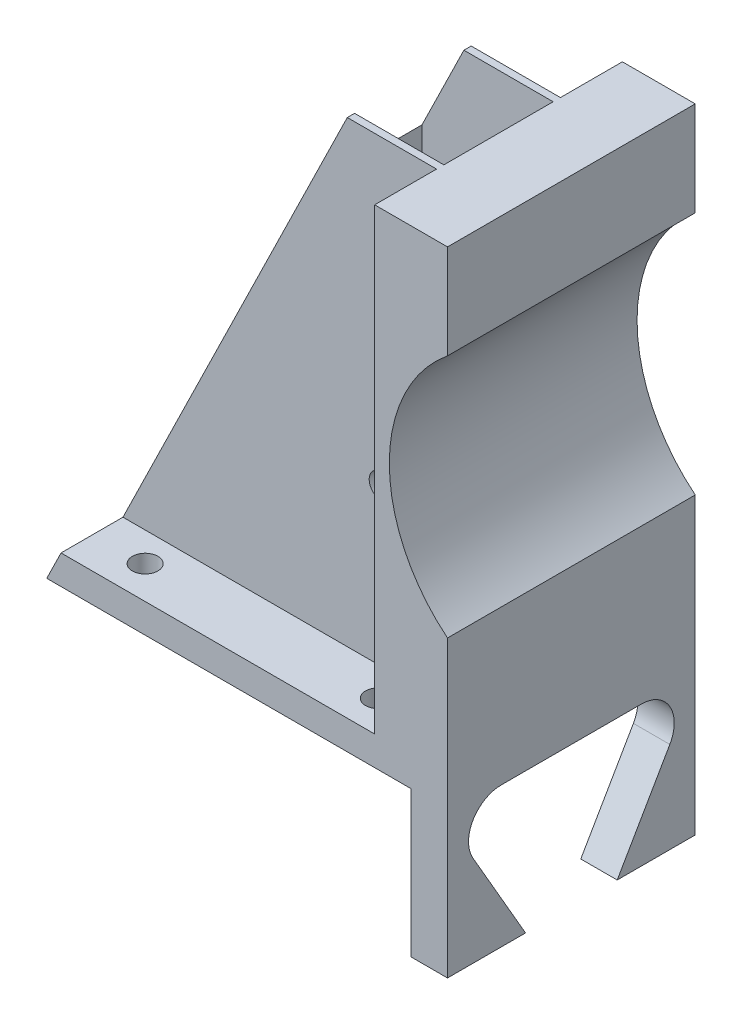
ISO-10303-21;
HEADER;
FILE_DESCRIPTION(('STEP AP214'),'2;1');
FILE_NAME('part.step','',(''),(''),'','','');
FILE_SCHEMA(('AUTOMOTIVE_DESIGN { 1 0 10303 214 1 1 1 1 }'));
ENDSEC;
DATA;
#1=APPLICATION_CONTEXT('core data for automotive mechanical design processes');
#2=APPLICATION_PROTOCOL_DEFINITION('international standard','automotive_design',2000,#1);
#3=PRODUCT_CONTEXT('',#1,'mechanical');
#4=PRODUCT('Part','Part','',(#3));
#5=PRODUCT_RELATED_PRODUCT_CATEGORY('part','',(#4));
#6=PRODUCT_DEFINITION_FORMATION('','',#4);
#7=PRODUCT_DEFINITION_CONTEXT('part definition',#1,'design');
#8=PRODUCT_DEFINITION('design','',#6,#7);
#9=PRODUCT_DEFINITION_SHAPE('','',#8);
#10=(LENGTH_UNIT() NAMED_UNIT(*) SI_UNIT(.MILLI.,.METRE.));
#11=(NAMED_UNIT(*) PLANE_ANGLE_UNIT() SI_UNIT($,.RADIAN.));
#12=(NAMED_UNIT(*) SI_UNIT($,.STERADIAN.) SOLID_ANGLE_UNIT());
#13=UNCERTAINTY_MEASURE_WITH_UNIT(LENGTH_MEASURE(1.E-05),#10,'distance_accuracy_value','');
#14=(GEOMETRIC_REPRESENTATION_CONTEXT(3) GLOBAL_UNCERTAINTY_ASSIGNED_CONTEXT((#13)) GLOBAL_UNIT_ASSIGNED_CONTEXT((#10,
#11,#12)) REPRESENTATION_CONTEXT('',''));
#15=CARTESIAN_POINT('',(0.,0.,0.));
#16=DIRECTION('',(0.,0.,1.));
#17=DIRECTION('',(1.,0.,0.));
#18=AXIS2_PLACEMENT_3D('',#15,#16,#17);
#19=CARTESIAN_POINT('',(7.74722603259813,76.8960000000002,34.));
#20=DIRECTION('',(0.898159011362224,-0.439670774908717,0.));
#21=DIRECTION('',(0.439670774908717,0.898159011362224,0.));
#22=AXIS2_PLACEMENT_3D('',#19,#20,#21);
#23=PLANE('',#22);
#24=DIRECTION('',(-0.439670774908717,-0.898159011362224,0.));
#25=VECTOR('',#24,1.);
#26=CARTESIAN_POINT('',(7.74722603259813,76.8960000000002,9.5));
#27=LINE('',#26,#25);
#28=CARTESIAN_POINT('',(7.74722603259813,76.8960000000002,9.5));
#29=VERTEX_POINT('',#28);
#30=CARTESIAN_POINT('',(1.99999999999999,65.1555725117614,9.5));
#31=VERTEX_POINT('',#30);
#32=EDGE_CURVE('E11',#29,#31,#27,.T.);
#33=ORIENTED_EDGE('',*,*,#32,.F.);
#34=DIRECTION('',(0.,0.,-1.));
#35=VECTOR('',#34,1.);
#36=CARTESIAN_POINT('',(7.74722603259813,76.8960000000002,34.));
#37=LINE('',#36,#35);
#38=CARTESIAN_POINT('',(7.74722603259813,76.8960000000002,8.5));
#39=VERTEX_POINT('',#38);
#40=EDGE_CURVE('E436',#29,#39,#37,.T.);
#41=ORIENTED_EDGE('',*,*,#40,.T.);
#42=DIRECTION('',(0.439670774908717,0.898159011362224,0.));
#43=VECTOR('',#42,1.);
#44=CARTESIAN_POINT('',(7.74722603259813,76.8960000000002,8.5));
#45=LINE('',#44,#43);
#46=CARTESIAN_POINT('',(-23.0419022941523,14.,8.5));
#47=VERTEX_POINT('',#46);
#48=EDGE_CURVE('E360',#47,#39,#45,.T.);
#49=ORIENTED_EDGE('',*,*,#48,.F.);
#50=DIRECTION('',(0.,0.,-1.));
#51=VECTOR('',#50,1.);
#52=CARTESIAN_POINT('',(-23.0419022941523,14.,8.5));
#53=LINE('',#52,#51);
#54=CARTESIAN_POINT('',(-23.0419022941523,14.,0.));
#55=VERTEX_POINT('',#54);
#56=EDGE_CURVE('E341',#47,#55,#53,.T.);
#57=ORIENTED_EDGE('',*,*,#56,.T.);
#58=DIRECTION('',(-0.439670774908717,-0.898159011362224,0.));
#59=VECTOR('',#58,1.);
#60=CARTESIAN_POINT('',(7.74722603259813,76.8960000000002,0.));
#61=LINE('',#60,#59);
#62=CARTESIAN_POINT('',(-25.,10.,0.));
#63=VERTEX_POINT('',#62);
#64=EDGE_CURVE('E408',#55,#63,#61,.T.);
#65=ORIENTED_EDGE('',*,*,#64,.T.);
#66=DIRECTION('',(0.,0.,-1.));
#67=VECTOR('',#66,1.);
#68=CARTESIAN_POINT('',(-25.,10.,34.));
#69=LINE('',#68,#67);
#70=CARTESIAN_POINT('',(-25.,10.,34.));
#71=VERTEX_POINT('',#70);
#72=EDGE_CURVE('E423',#71,#63,#69,.T.);
#73=ORIENTED_EDGE('',*,*,#72,.F.);
#74=DIRECTION('',(-0.439670774908717,-0.898159011362224,0.));
#75=VECTOR('',#74,1.);
#76=CARTESIAN_POINT('',(7.74722603259813,76.8960000000002,34.));
#77=LINE('',#76,#75);
#78=CARTESIAN_POINT('',(-23.0419022941523,14.,34.));
#79=VERTEX_POINT('',#78);
#80=EDGE_CURVE('E419',#79,#71,#77,.T.);
#81=ORIENTED_EDGE('',*,*,#80,.F.);
#82=DIRECTION('',(0.,0.,1.));
#83=VECTOR('',#82,1.);
#84=CARTESIAN_POINT('',(-23.0419022941523,14.,25.5));
#85=LINE('',#84,#83);
#86=CARTESIAN_POINT('',(-23.0419022941523,14.,25.5));
#87=VERTEX_POINT('',#86);
#88=EDGE_CURVE('E348',#87,#79,#85,.T.);
#89=ORIENTED_EDGE('',*,*,#88,.F.);
#90=DIRECTION('',(-0.439670774908717,-0.898159011362224,0.));
#91=VECTOR('',#90,1.);
#92=CARTESIAN_POINT('',(-23.0419022941523,14.,25.5));
#93=LINE('',#92,#91);
#94=CARTESIAN_POINT('',(7.74722603259813,76.8960000000002,25.5));
#95=VERTEX_POINT('',#94);
#96=EDGE_CURVE('E387',#95,#87,#93,.T.);
#97=ORIENTED_EDGE('',*,*,#96,.F.);
#98=CARTESIAN_POINT('',(7.74722603259813,76.8960000000002,24.5));
#99=VERTEX_POINT('',#98);
#100=EDGE_CURVE('E440',#95,#99,#37,.T.);
#101=ORIENTED_EDGE('',*,*,#100,.T.);
#102=DIRECTION('',(0.439670774908717,0.898159011362224,0.));
#103=VECTOR('',#102,1.);
#104=CARTESIAN_POINT('',(7.74722603259813,76.8960000000002,24.5));
#105=LINE('',#104,#103);
#106=CARTESIAN_POINT('',(1.99999999999999,65.1555725117614,24.5));
#107=VERTEX_POINT('',#106);
#108=EDGE_CURVE('E49',#107,#99,#105,.T.);
#109=ORIENTED_EDGE('',*,*,#108,.F.);
#110=DIRECTION('',(0.,0.,-1.));
#111=VECTOR('',#110,1.);
#112=CARTESIAN_POINT('',(1.99999999999999,65.1555725117614,34.));
#113=LINE('',#112,#111);
#114=EDGE_CURVE('E466',#107,#31,#113,.T.);
#115=ORIENTED_EDGE('',*,*,#114,.T.);
#116=EDGE_LOOP('',(#33,#41,#49,#57,#65,#73,#81,#89,#97,#101,#109,#115));
#117=FACE_BOUND('',#116,.T.);
#118=DIRECTION('',(-0.439670774908717,-0.898159011362225,0.));
#119=VECTOR('',#118,1.);
#120=CARTESIAN_POINT('',(7.74722603259813,76.8960000000002,10.5));
#121=LINE('',#120,#119);
#122=CARTESIAN_POINT('',(-10.3651777464937,39.8960000000002,10.5));
#123=VERTEX_POINT('',#122);
#124=CARTESIAN_POINT('',(-14.7708975846512,30.8960000000002,10.5));
#125=VERTEX_POINT('',#124);
#126=EDGE_CURVE('E236',#123,#125,#121,.T.);
#127=ORIENTED_EDGE('',*,*,#126,.F.);
#128=DIRECTION('',(0.,0.,-1.));
#129=VECTOR('',#128,1.);
#130=CARTESIAN_POINT('',(-10.3651777464937,39.8960000000002,34.));
#131=LINE('',#130,#129);
#132=CARTESIAN_POINT('',(-10.3651777464937,39.8960000000002,23.5));
#133=VERTEX_POINT('',#132);
#134=EDGE_CURVE('E232',#133,#123,#131,.T.);
#135=ORIENTED_EDGE('',*,*,#134,.F.);
#136=DIRECTION('',(0.439670774908717,0.898159011362225,0.));
#137=VECTOR('',#136,1.);
#138=CARTESIAN_POINT('',(7.74722603259813,76.8960000000002,23.5));
#139=LINE('',#138,#137);
#140=CARTESIAN_POINT('',(-14.7708975846512,30.8960000000002,23.5));
#141=VERTEX_POINT('',#140);
#142=EDGE_CURVE('E242',#141,#133,#139,.T.);
#143=ORIENTED_EDGE('',*,*,#142,.F.);
#144=DIRECTION('',(0.,0.,1.));
#145=VECTOR('',#144,1.);
#146=CARTESIAN_POINT('',(-14.7708975846512,30.8960000000002,34.));
#147=LINE('',#146,#145);
#148=EDGE_CURVE('E261',#125,#141,#147,.T.);
#149=ORIENTED_EDGE('',*,*,#148,.F.);
#150=EDGE_LOOP('',(#127,#135,#143,#149));
#151=FACE_BOUND('',#150,.T.);
#152=ADVANCED_FACE('F41',(#117,#151),#23,.F.);
#153=CARTESIAN_POINT('',(1.99999999999998,0.,0.));
#154=DIRECTION('',(-1.,0.,0.));
#155=DIRECTION('',(0.,-1.,0.));
#156=AXIS2_PLACEMENT_3D('',#153,#154,#155);
#157=PLANE('',#156);
#158=DIRECTION('',(0.,1.,0.));
#159=VECTOR('',#158,1.);
#160=CARTESIAN_POINT('',(1.99999999999998,0.,10.5));
#161=LINE('',#160,#159);
#162=CARTESIAN_POINT('',(1.99999999999998,30.8960000000002,10.5));
#163=VERTEX_POINT('',#162);
#164=CARTESIAN_POINT('',(1.99999999999999,39.8960000000002,10.5));
#165=VERTEX_POINT('',#164);
#166=EDGE_CURVE('E251',#163,#165,#161,.T.);
#167=ORIENTED_EDGE('',*,*,#166,.F.);
#168=DIRECTION('',(0.,0.,1.));
#169=VECTOR('',#168,1.);
#170=CARTESIAN_POINT('',(1.99999999999999,30.8960000000002,9.50000000000003));
#171=LINE('',#170,#169);
#172=CARTESIAN_POINT('',(1.99999999999999,30.8960000000002,9.50000000000003));
#173=VERTEX_POINT('',#172);
#174=EDGE_CURVE('E263',#173,#163,#171,.T.);
#175=ORIENTED_EDGE('',*,*,#174,.F.);
#176=DIRECTION('',(0.,-1.,0.));
#177=VECTOR('',#176,1.);
#178=CARTESIAN_POINT('',(1.99999999999999,76.8960000000002,9.5));
#179=LINE('',#178,#177);
#180=EDGE_CURVE('E276',#31,#173,#179,.T.);
#181=ORIENTED_EDGE('',*,*,#180,.F.);
#182=ORIENTED_EDGE('',*,*,#114,.F.);
#183=DIRECTION('',(0.,1.,0.));
#184=VECTOR('',#183,1.);
#185=CARTESIAN_POINT('',(1.99999999999999,76.8960000000002,24.5));
#186=LINE('',#185,#184);
#187=CARTESIAN_POINT('',(1.99999999999999,30.8960000000003,24.5));
#188=VERTEX_POINT('',#187);
#189=EDGE_CURVE('E277',#188,#107,#186,.T.);
#190=ORIENTED_EDGE('',*,*,#189,.F.);
#191=CARTESIAN_POINT('',(1.99999999999998,30.8960000000002,23.5));
#192=VERTEX_POINT('',#191);
#193=EDGE_CURVE('E252',#192,#188,#171,.T.);
#194=ORIENTED_EDGE('',*,*,#193,.F.);
#195=DIRECTION('',(0.,-1.,0.));
#196=VECTOR('',#195,1.);
#197=CARTESIAN_POINT('',(1.99999999999998,0.,23.5));
#198=LINE('',#197,#196);
#199=CARTESIAN_POINT('',(1.99999999999998,39.8960000000002,23.5));
#200=VERTEX_POINT('',#199);
#201=EDGE_CURVE('E241',#200,#192,#198,.T.);
#202=ORIENTED_EDGE('',*,*,#201,.F.);
#203=DIRECTION('',(0.,0.,1.));
#204=VECTOR('',#203,1.);
#205=CARTESIAN_POINT('',(1.99999999999999,39.8960000000002,0.));
#206=LINE('',#205,#204);
#207=EDGE_CURVE('E229',#165,#200,#206,.T.);
#208=ORIENTED_EDGE('',*,*,#207,.F.);
#209=EDGE_LOOP('',(#167,#175,#181,#182,#190,#194,#202,#208));
#210=FACE_BOUND('',#209,.T.);
#211=ADVANCED_FACE('F248',(#210),#157,.F.);
#212=CARTESIAN_POINT('',(30.,76.8960000000002,34.));
#213=DIRECTION('',(0.,-1.,0.));
#214=DIRECTION('',(0.,0.,-1.));
#215=AXIS2_PLACEMENT_3D('',#212,#213,#214);
#216=PLANE('',#215);
#217=DIRECTION('',(1.,0.,0.));
#218=VECTOR('',#217,1.);
#219=CARTESIAN_POINT('',(1.99999999999999,76.8960000000002,9.5));
#220=LINE('',#219,#218);
#221=CARTESIAN_POINT('',(20.,76.8960000000002,9.5));
#222=VERTEX_POINT('',#221);
#223=EDGE_CURVE('E281',#29,#222,#220,.T.);
#224=ORIENTED_EDGE('',*,*,#223,.T.);
#225=DIRECTION('',(0.,0.,-1.));
#226=VECTOR('',#225,1.);
#227=CARTESIAN_POINT('',(20.,76.8960000000002,9.5));
#228=LINE('',#227,#226);
#229=CARTESIAN_POINT('',(20.,76.8960000000002,24.5));
#230=VERTEX_POINT('',#229);
#231=EDGE_CURVE('E278',#230,#222,#228,.T.);
#232=ORIENTED_EDGE('',*,*,#231,.F.);
#233=DIRECTION('',(1.,0.,0.));
#234=VECTOR('',#233,1.);
#235=CARTESIAN_POINT('',(1.99999999999999,76.8960000000002,24.5));
#236=LINE('',#235,#234);
#237=EDGE_CURVE('E293',#99,#230,#236,.T.);
#238=ORIENTED_EDGE('',*,*,#237,.F.);
#239=ORIENTED_EDGE('',*,*,#100,.F.);
#240=DIRECTION('',(-1.,0.,0.));
#241=VECTOR('',#240,1.);
#242=CARTESIAN_POINT('',(7.74722603259813,76.8960000000002,25.5));
#243=LINE('',#242,#241);
#244=CARTESIAN_POINT('',(20.,76.8960000000002,25.5));
#245=VERTEX_POINT('',#244);
#246=EDGE_CURVE('E398',#245,#95,#243,.T.);
#247=ORIENTED_EDGE('',*,*,#246,.F.);
#248=DIRECTION('',(0.,0.,1.));
#249=VECTOR('',#248,1.);
#250=CARTESIAN_POINT('',(20.,76.8960000000002,25.5));
#251=LINE('',#250,#249);
#252=CARTESIAN_POINT('',(20.,76.8960000000002,34.));
#253=VERTEX_POINT('',#252);
#254=EDGE_CURVE('E388',#245,#253,#251,.T.);
#255=ORIENTED_EDGE('',*,*,#254,.T.);
#256=DIRECTION('',(-1.,0.,0.));
#257=VECTOR('',#256,1.);
#258=CARTESIAN_POINT('',(30.,76.8960000000002,34.));
#259=LINE('',#258,#257);
#260=CARTESIAN_POINT('',(30.,76.8960000000002,34.));
#261=VERTEX_POINT('',#260);
#262=EDGE_CURVE('E412',#261,#253,#259,.T.);
#263=ORIENTED_EDGE('',*,*,#262,.F.);
#264=DIRECTION('',(0.,0.,-1.));
#265=VECTOR('',#264,1.);
#266=CARTESIAN_POINT('',(30.,76.8960000000002,34.));
#267=LINE('',#266,#265);
#268=CARTESIAN_POINT('',(30.,76.8960000000002,0.));
#269=VERTEX_POINT('',#268);
#270=EDGE_CURVE('E439',#261,#269,#267,.T.);
#271=ORIENTED_EDGE('',*,*,#270,.T.);
#272=DIRECTION('',(-1.,0.,0.));
#273=VECTOR('',#272,1.);
#274=CARTESIAN_POINT('',(30.,76.8960000000002,0.));
#275=LINE('',#274,#273);
#276=CARTESIAN_POINT('',(20.,76.8960000000002,0.));
#277=VERTEX_POINT('',#276);
#278=EDGE_CURVE('E427',#269,#277,#275,.T.);
#279=ORIENTED_EDGE('',*,*,#278,.T.);
#280=DIRECTION('',(0.,0.,-1.));
#281=VECTOR('',#280,1.);
#282=CARTESIAN_POINT('',(20.,76.8960000000002,8.5));
#283=LINE('',#282,#281);
#284=CARTESIAN_POINT('',(20.,76.8960000000002,8.5));
#285=VERTEX_POINT('',#284);
#286=EDGE_CURVE('E347',#285,#277,#283,.T.);
#287=ORIENTED_EDGE('',*,*,#286,.F.);
#288=DIRECTION('',(1.,0.,0.));
#289=VECTOR('',#288,1.);
#290=CARTESIAN_POINT('',(20.,76.8960000000002,8.5));
#291=LINE('',#290,#289);
#292=EDGE_CURVE('E370',#39,#285,#291,.T.);
#293=ORIENTED_EDGE('',*,*,#292,.F.);
#294=ORIENTED_EDGE('',*,*,#40,.F.);
#295=EDGE_LOOP('',(#224,#232,#238,#239,#247,#255,#263,#271,#279,#287,#293,#294));
#296=FACE_BOUND('',#295,.T.);
#297=ADVANCED_FACE('F483',(#296),#216,.F.);
#298=CARTESIAN_POINT('',(-25.,-10.,34.));
#299=DIRECTION('',(0.,1.,0.));
#300=DIRECTION('',(-1.,0.,0.));
#301=AXIS2_PLACEMENT_3D('',#298,#299,#300);
#302=PLANE('',#301);
#303=DIRECTION('',(0.,0.,-1.));
#304=VECTOR('',#303,1.);
#305=CARTESIAN_POINT('',(30.,-10.,34.));
#306=LINE('',#305,#304);
#307=CARTESIAN_POINT('',(30.,-10.,10.7103964701336));
#308=VERTEX_POINT('',#307);
#309=CARTESIAN_POINT('',(30.,-10.,0.));
#310=VERTEX_POINT('',#309);
#311=EDGE_CURVE('E446',#308,#310,#306,.T.);
#312=ORIENTED_EDGE('',*,*,#311,.F.);
#313=DIRECTION('',(-1.,0.,0.));
#314=VECTOR('',#313,1.);
#315=CARTESIAN_POINT('',(-25.,-10.,10.7103964701336));
#316=LINE('',#315,#314);
#317=CARTESIAN_POINT('',(25.,-10.,10.7103964701336));
#318=VERTEX_POINT('',#317);
#319=EDGE_CURVE('E336',#308,#318,#316,.T.);
#320=ORIENTED_EDGE('',*,*,#319,.T.);
#321=DIRECTION('',(0.,0.,1.));
#322=VECTOR('',#321,1.);
#323=CARTESIAN_POINT('',(25.,-10.,25.5));
#324=LINE('',#323,#322);
#325=CARTESIAN_POINT('',(25.,-10.,0.));
#326=VERTEX_POINT('',#325);
#327=EDGE_CURVE('E385',#326,#318,#324,.T.);
#328=ORIENTED_EDGE('',*,*,#327,.F.);
#329=DIRECTION('',(1.,0.,0.));
#330=VECTOR('',#329,1.);
#331=CARTESIAN_POINT('',(-25.,-10.,0.));
#332=LINE('',#331,#330);
#333=EDGE_CURVE('E382',#326,#310,#332,.T.);
#334=ORIENTED_EDGE('',*,*,#333,.T.);
#335=EDGE_LOOP('',(#312,#320,#328,#334));
#336=FACE_BOUND('',#335,.T.);
#337=ADVANCED_FACE('F576',(#336),#302,.F.);
#338=CARTESIAN_POINT('',(25.,-10.,23.2896035298664));
#339=VERTEX_POINT('',#338);
#340=CARTESIAN_POINT('',(25.,-10.,34.));
#341=VERTEX_POINT('',#340);
#342=EDGE_CURVE('E377',#339,#341,#324,.T.);
#343=ORIENTED_EDGE('',*,*,#342,.F.);
#344=DIRECTION('',(1.,0.,0.));
#345=VECTOR('',#344,1.);
#346=CARTESIAN_POINT('',(-25.,-10.,23.2896035298664));
#347=LINE('',#346,#345);
#348=CARTESIAN_POINT('',(30.,-10.,23.2896035298664));
#349=VERTEX_POINT('',#348);
#350=EDGE_CURVE('E327',#339,#349,#347,.T.);
#351=ORIENTED_EDGE('',*,*,#350,.T.);
#352=CARTESIAN_POINT('',(30.,-10.,34.));
#353=VERTEX_POINT('',#352);
#354=EDGE_CURVE('E448',#353,#349,#306,.T.);
#355=ORIENTED_EDGE('',*,*,#354,.F.);
#356=DIRECTION('',(1.,0.,0.));
#357=VECTOR('',#356,1.);
#358=CARTESIAN_POINT('',(-25.,-10.,34.));
#359=LINE('',#358,#357);
#360=EDGE_CURVE('E406',#341,#353,#359,.T.);
#361=ORIENTED_EDGE('',*,*,#360,.F.);
#362=EDGE_LOOP('',(#343,#351,#355,#361));
#363=FACE_BOUND('',#362,.T.);
#364=ADVANCED_FACE('F43',(#363),#302,.F.);
#365=CARTESIAN_POINT('',(30.,-10.,34.));
#366=DIRECTION('',(-1.,0.,0.));
#367=DIRECTION('',(0.,-1.,0.));
#368=AXIS2_PLACEMENT_3D('',#365,#366,#367);
#369=PLANE('',#368);
#370=CARTESIAN_POINT('',(30.,4.75700000000012,7.385));
#371=DIRECTION('',(1.,0.,0.));
#372=DIRECTION('',(0.,0.,-1.));
#373=AXIS2_PLACEMENT_3D('',#370,#371,#372);
#374=CIRCLE('',#373,4.5);
#375=CARTESIAN_POINT('',(30.,2.5066282217901,3.48810035286564));
#376=VERTEX_POINT('',#375);
#377=CARTESIAN_POINT('',(30.,9.25700000000012,7.385));
#378=VERTEX_POINT('',#377);
#379=EDGE_CURVE('E321',#376,#378,#374,.T.);
#380=ORIENTED_EDGE('',*,*,#379,.F.);
#381=DIRECTION('',(0.,0.86597769936319,-0.500082617380004));
#382=VECTOR('',#381,1.);
#383=CARTESIAN_POINT('',(30.,2.5066282217901,3.48810035286564));
#384=LINE('',#383,#382);
#385=EDGE_CURVE('E319',#308,#376,#384,.T.);
#386=ORIENTED_EDGE('',*,*,#385,.F.);
#387=ORIENTED_EDGE('',*,*,#311,.T.);
#388=DIRECTION('',(0.,1.,0.));
#389=VECTOR('',#388,1.);
#390=CARTESIAN_POINT('',(30.,-10.,0.));
#391=LINE('',#390,#389);
#392=CARTESIAN_POINT('',(30.,30.4140000000002,0.));
#393=VERTEX_POINT('',#392);
#394=EDGE_CURVE('E425',#310,#393,#391,.T.);
#395=ORIENTED_EDGE('',*,*,#394,.T.);
#396=DIRECTION('',(0.,0.,-1.));
#397=VECTOR('',#396,1.);
#398=CARTESIAN_POINT('',(30.,30.4140000000002,34.));
#399=LINE('',#398,#397);
#400=CARTESIAN_POINT('',(30.,30.4140000000002,34.));
#401=VERTEX_POINT('',#400);
#402=EDGE_CURVE('E447',#401,#393,#399,.T.);
#403=ORIENTED_EDGE('',*,*,#402,.F.);
#404=DIRECTION('',(0.,1.,0.));
#405=VECTOR('',#404,1.);
#406=CARTESIAN_POINT('',(30.,-10.,34.));
#407=LINE('',#406,#405);
#408=EDGE_CURVE('E407',#353,#401,#407,.T.);
#409=ORIENTED_EDGE('',*,*,#408,.F.);
#410=ORIENTED_EDGE('',*,*,#354,.T.);
#411=DIRECTION('',(0.,-0.86597769936319,-0.500082617380005));
#412=VECTOR('',#411,1.);
#413=CARTESIAN_POINT('',(30.,2.5066282217901,30.5118996471344));
#414=LINE('',#413,#412);
#415=CARTESIAN_POINT('',(30.,2.5066282217901,30.5118996471344));
#416=VERTEX_POINT('',#415);
#417=EDGE_CURVE('E317',#416,#349,#414,.T.);
#418=ORIENTED_EDGE('',*,*,#417,.F.);
#419=CARTESIAN_POINT('',(30.,4.75700000000012,26.615));
#420=DIRECTION('',(1.,0.,0.));
#421=DIRECTION('',(0.,0.,-1.));
#422=AXIS2_PLACEMENT_3D('',#419,#420,#421);
#423=CIRCLE('',#422,4.5);
#424=CARTESIAN_POINT('',(30.,9.25700000000012,26.615));
#425=VERTEX_POINT('',#424);
#426=EDGE_CURVE('E312',#425,#416,#423,.T.);
#427=ORIENTED_EDGE('',*,*,#426,.F.);
#428=DIRECTION('',(0.,0.,1.));
#429=VECTOR('',#428,1.);
#430=CARTESIAN_POINT('',(30.,9.25700000000012,26.615));
#431=LINE('',#430,#429);
#432=EDGE_CURVE('E323',#378,#425,#431,.T.);
#433=ORIENTED_EDGE('',*,*,#432,.F.);
#434=EDGE_LOOP('',(#380,#386,#387,#395,#403,#409,#410,#418,#427,#433));
#435=FACE_BOUND('',#434,.T.);
#436=ADVANCED_FACE('F583',(#435),#369,.F.);
#437=CARTESIAN_POINT('',(43.6050139286955,47.1780000000002,34.));
#438=DIRECTION('',(0.,0.,-1.));
#439=DIRECTION('',(-1.,0.,0.));
#440=AXIS2_PLACEMENT_3D('',#437,#438,#439);
#441=CYLINDRICAL_SURFACE('',#440,21.59);
#442=CARTESIAN_POINT('',(43.6050139286955,47.1780000000002,0.));
#443=DIRECTION('',(0.,0.,-1.));
#444=DIRECTION('',(1.,0.,0.));
#445=AXIS2_PLACEMENT_3D('',#442,#443,#444);
#446=CIRCLE('',#445,21.59);
#447=CARTESIAN_POINT('',(30.,63.9420000000002,0.));
#448=VERTEX_POINT('',#447);
#449=EDGE_CURVE('E428',#393,#448,#446,.T.);
#450=ORIENTED_EDGE('',*,*,#449,.T.);
#451=DIRECTION('',(0.,0.,-1.));
#452=VECTOR('',#451,1.);
#453=CARTESIAN_POINT('',(30.,63.9420000000002,34.));
#454=LINE('',#453,#452);
#455=CARTESIAN_POINT('',(30.,63.9420000000002,34.));
#456=VERTEX_POINT('',#455);
#457=EDGE_CURVE('E442',#456,#448,#454,.T.);
#458=ORIENTED_EDGE('',*,*,#457,.F.);
#459=CARTESIAN_POINT('',(43.6050139286955,47.1780000000002,34.));
#460=DIRECTION('',(0.,0.,-1.));
#461=DIRECTION('',(1.,0.,0.));
#462=AXIS2_PLACEMENT_3D('',#459,#460,#461);
#463=CIRCLE('',#462,21.59);
#464=EDGE_CURVE('E414',#401,#456,#463,.T.);
#465=ORIENTED_EDGE('',*,*,#464,.F.);
#466=ORIENTED_EDGE('',*,*,#402,.T.);
#467=EDGE_LOOP('',(#450,#458,#465,#466));
#468=FACE_BOUND('',#467,.T.);
#469=ADVANCED_FACE('F585',(#468),#441,.F.);
#470=CARTESIAN_POINT('',(30.,63.9420000000002,34.));
#471=DIRECTION('',(-1.,0.,0.));
#472=DIRECTION('',(0.,-1.,0.));
#473=AXIS2_PLACEMENT_3D('',#470,#471,#472);
#474=PLANE('',#473);
#475=DIRECTION('',(0.,1.,0.));
#476=VECTOR('',#475,1.);
#477=CARTESIAN_POINT('',(30.,63.9420000000002,0.));
#478=LINE('',#477,#476);
#479=EDGE_CURVE('E426',#448,#269,#478,.T.);
#480=ORIENTED_EDGE('',*,*,#479,.T.);
#481=ORIENTED_EDGE('',*,*,#270,.F.);
#482=DIRECTION('',(0.,1.,0.));
#483=VECTOR('',#482,1.);
#484=CARTESIAN_POINT('',(30.,63.9420000000002,34.));
#485=LINE('',#484,#483);
#486=EDGE_CURVE('E415',#456,#261,#485,.T.);
#487=ORIENTED_EDGE('',*,*,#486,.F.);
#488=ORIENTED_EDGE('',*,*,#457,.T.);
#489=EDGE_LOOP('',(#480,#481,#487,#488));
#490=FACE_BOUND('',#489,.T.);
#491=ADVANCED_FACE('F506',(#490),#474,.F.);
#492=CARTESIAN_POINT('',(43.6050139286955,47.1780000000002,34.));
#493=DIRECTION('',(0.,0.,1.));
#494=DIRECTION('',(1.,0.,0.));
#495=AXIS2_PLACEMENT_3D('',#492,#493,#494);
#496=PLANE('',#495);
#497=DIRECTION('',(-1.,0.,0.));
#498=VECTOR('',#497,1.);
#499=CARTESIAN_POINT('',(-25.,10.,34.));
#500=LINE('',#499,#498);
#501=CARTESIAN_POINT('',(25.,10.,34.));
#502=VERTEX_POINT('',#501);
#503=EDGE_CURVE('E374',#502,#71,#500,.T.);
#504=ORIENTED_EDGE('',*,*,#503,.F.);
#505=DIRECTION('',(0.,1.,0.));
#506=VECTOR('',#505,1.);
#507=CARTESIAN_POINT('',(25.,-10.,34.));
#508=LINE('',#507,#506);
#509=EDGE_CURVE('E375',#341,#502,#508,.T.);
#510=ORIENTED_EDGE('',*,*,#509,.F.);
#511=ORIENTED_EDGE('',*,*,#360,.T.);
#512=ORIENTED_EDGE('',*,*,#408,.T.);
#513=ORIENTED_EDGE('',*,*,#464,.T.);
#514=ORIENTED_EDGE('',*,*,#486,.T.);
#515=ORIENTED_EDGE('',*,*,#262,.T.);
#516=DIRECTION('',(0.,1.,0.));
#517=VECTOR('',#516,1.);
#518=CARTESIAN_POINT('',(20.,76.8960000000002,34.));
#519=LINE('',#518,#517);
#520=CARTESIAN_POINT('',(20.,14.,34.));
#521=VERTEX_POINT('',#520);
#522=EDGE_CURVE('E395',#521,#253,#519,.T.);
#523=ORIENTED_EDGE('',*,*,#522,.F.);
#524=DIRECTION('',(1.,0.,0.));
#525=VECTOR('',#524,1.);
#526=CARTESIAN_POINT('',(20.,14.,34.));
#527=LINE('',#526,#525);
#528=EDGE_CURVE('E376',#79,#521,#527,.T.);
#529=ORIENTED_EDGE('',*,*,#528,.F.);
#530=ORIENTED_EDGE('',*,*,#80,.T.);
#531=EDGE_LOOP('',(#504,#510,#511,#512,#513,#514,#515,#523,#529,#530));
#532=FACE_BOUND('',#531,.T.);
#533=ADVANCED_FACE('F497',(#532),#496,.T.);
#534=CARTESIAN_POINT('',(43.6050139286955,47.1780000000002,0.));
#535=DIRECTION('',(0.,0.,1.));
#536=DIRECTION('',(1.,0.,0.));
#537=AXIS2_PLACEMENT_3D('',#534,#535,#536);
#538=PLANE('',#537);
#539=ORIENTED_EDGE('',*,*,#333,.F.);
#540=DIRECTION('',(0.,-1.,0.));
#541=VECTOR('',#540,1.);
#542=CARTESIAN_POINT('',(25.,-10.,0.));
#543=LINE('',#542,#541);
#544=CARTESIAN_POINT('',(25.,10.,0.));
#545=VERTEX_POINT('',#544);
#546=EDGE_CURVE('E344',#545,#326,#543,.T.);
#547=ORIENTED_EDGE('',*,*,#546,.F.);
#548=DIRECTION('',(1.,0.,0.));
#549=VECTOR('',#548,1.);
#550=CARTESIAN_POINT('',(-25.,10.,0.));
#551=LINE('',#550,#549);
#552=EDGE_CURVE('E345',#63,#545,#551,.T.);
#553=ORIENTED_EDGE('',*,*,#552,.F.);
#554=ORIENTED_EDGE('',*,*,#64,.F.);
#555=DIRECTION('',(-1.,0.,0.));
#556=VECTOR('',#555,1.);
#557=CARTESIAN_POINT('',(-23.0419022941523,14.,0.));
#558=LINE('',#557,#556);
#559=CARTESIAN_POINT('',(20.,14.,0.));
#560=VERTEX_POINT('',#559);
#561=EDGE_CURVE('E357',#560,#55,#558,.T.);
#562=ORIENTED_EDGE('',*,*,#561,.F.);
#563=DIRECTION('',(0.,-1.,0.));
#564=VECTOR('',#563,1.);
#565=CARTESIAN_POINT('',(20.,14.,0.));
#566=LINE('',#565,#564);
#567=EDGE_CURVE('E349',#277,#560,#566,.T.);
#568=ORIENTED_EDGE('',*,*,#567,.F.);
#569=ORIENTED_EDGE('',*,*,#278,.F.);
#570=ORIENTED_EDGE('',*,*,#479,.F.);
#571=ORIENTED_EDGE('',*,*,#449,.F.);
#572=ORIENTED_EDGE('',*,*,#394,.F.);
#573=EDGE_LOOP('',(#539,#547,#553,#554,#562,#568,#569,#570,#571,#572));
#574=FACE_BOUND('',#573,.T.);
#575=ADVANCED_FACE('F514',(#574),#538,.F.);
#576=CARTESIAN_POINT('',(20.,14.,25.5));
#577=DIRECTION('',(0.,-1.,0.));
#578=DIRECTION('',(1.,0.,0.));
#579=AXIS2_PLACEMENT_3D('',#576,#577,#578);
#580=PLANE('',#579);
#581=CARTESIAN_POINT('',(-16.,14.,29.5));
#582=DIRECTION('',(0.,-1.,0.));
#583=DIRECTION('',(1.,0.,0.));
#584=AXIS2_PLACEMENT_3D('',#581,#582,#583);
#585=CIRCLE('',#584,1.75);
#586=CARTESIAN_POINT('',(-14.25,14.,29.5));
#587=VERTEX_POINT('',#586);
#588=EDGE_CURVE('E307',#587,#587,#585,.T.);
#589=ORIENTED_EDGE('',*,*,#588,.T.);
#590=EDGE_LOOP('',(#589));
#591=FACE_BOUND('',#590,.T.);
#592=CARTESIAN_POINT('',(16.,14.,29.5));
#593=DIRECTION('',(0.,-1.,0.));
#594=DIRECTION('',(1.,0.,0.));
#595=AXIS2_PLACEMENT_3D('',#592,#593,#594);
#596=CIRCLE('',#595,1.75);
#597=CARTESIAN_POINT('',(17.75,14.,29.5));
#598=VERTEX_POINT('',#597);
#599=EDGE_CURVE('E306',#598,#598,#596,.T.);
#600=ORIENTED_EDGE('',*,*,#599,.T.);
#601=EDGE_LOOP('',(#600));
#602=FACE_BOUND('',#601,.T.);
#603=ORIENTED_EDGE('',*,*,#528,.T.);
#604=DIRECTION('',(0.,0.,1.));
#605=VECTOR('',#604,1.);
#606=CARTESIAN_POINT('',(20.,14.,25.5));
#607=LINE('',#606,#605);
#608=CARTESIAN_POINT('',(20.,14.,25.5));
#609=VERTEX_POINT('',#608);
#610=EDGE_CURVE('E383',#609,#521,#607,.T.);
#611=ORIENTED_EDGE('',*,*,#610,.F.);
#612=DIRECTION('',(1.,0.,0.));
#613=VECTOR('',#612,1.);
#614=CARTESIAN_POINT('',(20.,14.,25.5));
#615=LINE('',#614,#613);
#616=EDGE_CURVE('E392',#87,#609,#615,.T.);
#617=ORIENTED_EDGE('',*,*,#616,.F.);
#618=ORIENTED_EDGE('',*,*,#88,.T.);
#619=EDGE_LOOP('',(#603,#611,#617,#618));
#620=FACE_BOUND('',#619,.T.);
#621=ADVANCED_FACE('F656',(#591,#602,#620),#580,.F.);
#622=CARTESIAN_POINT('',(20.,76.8960000000002,25.5));
#623=DIRECTION('',(1.,0.,0.));
#624=DIRECTION('',(0.,1.,0.));
#625=AXIS2_PLACEMENT_3D('',#622,#623,#624);
#626=PLANE('',#625);
#627=ORIENTED_EDGE('',*,*,#522,.T.);
#628=ORIENTED_EDGE('',*,*,#254,.F.);
#629=DIRECTION('',(0.,1.,0.));
#630=VECTOR('',#629,1.);
#631=CARTESIAN_POINT('',(20.,76.8960000000002,25.5));
#632=LINE('',#631,#630);
#633=EDGE_CURVE('E402',#609,#245,#632,.T.);
#634=ORIENTED_EDGE('',*,*,#633,.F.);
#635=ORIENTED_EDGE('',*,*,#610,.T.);
#636=EDGE_LOOP('',(#627,#628,#634,#635));
#637=FACE_BOUND('',#636,.T.);
#638=ADVANCED_FACE('F658',(#637),#626,.F.);
#639=CARTESIAN_POINT('',(0.,0.,25.5));
#640=DIRECTION('',(0.,0.,1.));
#641=DIRECTION('',(1.,0.,0.));
#642=AXIS2_PLACEMENT_3D('',#639,#640,#641);
#643=PLANE('',#642);
#644=CARTESIAN_POINT('',(12.5,35.3960000000003,25.5));
#645=DIRECTION('',(0.,0.,1.));
#646=DIRECTION('',(1.,0.,0.));
#647=AXIS2_PLACEMENT_3D('',#644,#645,#646);
#648=CIRCLE('',#647,1.75);
#649=CARTESIAN_POINT('',(14.25,35.3960000000003,25.5));
#650=VERTEX_POINT('',#649);
#651=EDGE_CURVE('E549',#650,#650,#648,.T.);
#652=ORIENTED_EDGE('',*,*,#651,.F.);
#653=EDGE_LOOP('',(#652));
#654=FACE_BOUND('',#653,.T.);
#655=ORIENTED_EDGE('',*,*,#616,.T.);
#656=ORIENTED_EDGE('',*,*,#633,.T.);
#657=ORIENTED_EDGE('',*,*,#246,.T.);
#658=ORIENTED_EDGE('',*,*,#96,.T.);
#659=EDGE_LOOP('',(#655,#656,#657,#658));
#660=FACE_BOUND('',#659,.T.);
#661=ADVANCED_FACE('F495',(#654,#660),#643,.T.);
#662=CARTESIAN_POINT('',(-25.,10.,25.5));
#663=DIRECTION('',(0.,1.,0.));
#664=DIRECTION('',(0.,0.,1.));
#665=AXIS2_PLACEMENT_3D('',#662,#663,#664);
#666=PLANE('',#665);
#667=CARTESIAN_POINT('',(16.,10.,4.5));
#668=DIRECTION('',(0.,-1.,0.));
#669=DIRECTION('',(0.,0.,-1.));
#670=AXIS2_PLACEMENT_3D('',#667,#668,#669);
#671=CIRCLE('',#670,1.75);
#672=CARTESIAN_POINT('',(16.,10.,2.75));
#673=VERTEX_POINT('',#672);
#674=EDGE_CURVE('E300',#673,#673,#671,.T.);
#675=ORIENTED_EDGE('',*,*,#674,.F.);
#676=EDGE_LOOP('',(#675));
#677=FACE_BOUND('',#676,.T.);
#678=CARTESIAN_POINT('',(-16.,10.,29.5));
#679=DIRECTION('',(0.,-1.,0.));
#680=DIRECTION('',(0.,0.,-1.));
#681=AXIS2_PLACEMENT_3D('',#678,#679,#680);
#682=CIRCLE('',#681,1.75);
#683=CARTESIAN_POINT('',(-16.,10.,27.75));
#684=VERTEX_POINT('',#683);
#685=EDGE_CURVE('E298',#684,#684,#682,.T.);
#686=ORIENTED_EDGE('',*,*,#685,.F.);
#687=EDGE_LOOP('',(#686));
#688=FACE_BOUND('',#687,.T.);
#689=CARTESIAN_POINT('',(-16.,10.,4.5));
#690=DIRECTION('',(0.,-1.,0.));
#691=DIRECTION('',(0.,0.,-1.));
#692=AXIS2_PLACEMENT_3D('',#689,#690,#691);
#693=CIRCLE('',#692,1.75);
#694=CARTESIAN_POINT('',(-16.,10.,2.75));
#695=VERTEX_POINT('',#694);
#696=EDGE_CURVE('E291',#695,#695,#693,.T.);
#697=ORIENTED_EDGE('',*,*,#696,.F.);
#698=EDGE_LOOP('',(#697));
#699=FACE_BOUND('',#698,.T.);
#700=CARTESIAN_POINT('',(16.,10.,29.5));
#701=DIRECTION('',(0.,-1.,0.));
#702=DIRECTION('',(0.,0.,-1.));
#703=AXIS2_PLACEMENT_3D('',#700,#701,#702);
#704=CIRCLE('',#703,1.75);
#705=CARTESIAN_POINT('',(16.,10.,27.75));
#706=VERTEX_POINT('',#705);
#707=EDGE_CURVE('E297',#706,#706,#704,.T.);
#708=ORIENTED_EDGE('',*,*,#707,.F.);
#709=EDGE_LOOP('',(#708));
#710=FACE_BOUND('',#709,.T.);
#711=ORIENTED_EDGE('',*,*,#503,.T.);
#712=ORIENTED_EDGE('',*,*,#72,.T.);
#713=ORIENTED_EDGE('',*,*,#552,.T.);
#714=DIRECTION('',(0.,0.,1.));
#715=VECTOR('',#714,1.);
#716=CARTESIAN_POINT('',(25.,10.,25.5));
#717=LINE('',#716,#715);
#718=EDGE_CURVE('E378',#545,#502,#717,.T.);
#719=ORIENTED_EDGE('',*,*,#718,.T.);
#720=EDGE_LOOP('',(#711,#712,#713,#719));
#721=FACE_BOUND('',#720,.T.);
#722=ADVANCED_FACE('F654',(#677,#688,#699,#710,#721),#666,.F.);
#723=CARTESIAN_POINT('',(25.,-10.,25.5));
#724=DIRECTION('',(1.,0.,0.));
#725=DIRECTION('',(0.,0.,-1.));
#726=AXIS2_PLACEMENT_3D('',#723,#724,#725);
#727=PLANE('',#726);
#728=ORIENTED_EDGE('',*,*,#327,.T.);
#729=DIRECTION('',(0.,0.86597769936319,-0.500082617380004));
#730=VECTOR('',#729,1.);
#731=CARTESIAN_POINT('',(25.,-16.4047915389985,14.4090193318435));
#732=LINE('',#731,#730);
#733=CARTESIAN_POINT('',(25.,2.5066282217901,3.48810035286564));
#734=VERTEX_POINT('',#733);
#735=EDGE_CURVE('E465',#318,#734,#732,.T.);
#736=ORIENTED_EDGE('',*,*,#735,.T.);
#737=CARTESIAN_POINT('',(25.,4.75700000000012,7.385));
#738=DIRECTION('',(1.,0.,0.));
#739=DIRECTION('',(0.,0.,-1.));
#740=AXIS2_PLACEMENT_3D('',#737,#738,#739);
#741=CIRCLE('',#740,4.5);
#742=CARTESIAN_POINT('',(25.,9.25700000000012,7.385));
#743=VERTEX_POINT('',#742);
#744=EDGE_CURVE('E462',#734,#743,#741,.T.);
#745=ORIENTED_EDGE('',*,*,#744,.T.);
#746=DIRECTION('',(0.,0.,1.));
#747=VECTOR('',#746,1.);
#748=CARTESIAN_POINT('',(25.,9.25700000000012,25.5));
#749=LINE('',#748,#747);
#750=CARTESIAN_POINT('',(25.,9.25700000000012,26.615));
#751=VERTEX_POINT('',#750);
#752=EDGE_CURVE('E458',#743,#751,#749,.T.);
#753=ORIENTED_EDGE('',*,*,#752,.T.);
#754=CARTESIAN_POINT('',(25.,4.75700000000012,26.615));
#755=DIRECTION('',(1.,0.,0.));
#756=DIRECTION('',(0.,0.,-1.));
#757=AXIS2_PLACEMENT_3D('',#754,#755,#756);
#758=CIRCLE('',#757,4.5);
#759=CARTESIAN_POINT('',(25.,2.5066282217901,30.5118996471344));
#760=VERTEX_POINT('',#759);
#761=EDGE_CURVE('E459',#751,#760,#758,.T.);
#762=ORIENTED_EDGE('',*,*,#761,.T.);
#763=DIRECTION('',(0.,-0.86597769936319,-0.500082617380005));
#764=VECTOR('',#763,1.);
#765=CARTESIAN_POINT('',(25.,-9.04276483266405,23.8423852796523));
#766=LINE('',#765,#764);
#767=EDGE_CURVE('E452',#760,#339,#766,.T.);
#768=ORIENTED_EDGE('',*,*,#767,.T.);
#769=ORIENTED_EDGE('',*,*,#342,.T.);
#770=ORIENTED_EDGE('',*,*,#509,.T.);
#771=ORIENTED_EDGE('',*,*,#718,.F.);
#772=ORIENTED_EDGE('',*,*,#546,.T.);
#773=EDGE_LOOP('',(#728,#736,#745,#753,#762,#768,#769,#770,#771,#772));
#774=FACE_BOUND('',#773,.T.);
#775=ADVANCED_FACE('F609',(#774),#727,.F.);
#776=CARTESIAN_POINT('',(-23.0419022941523,14.,8.5));
#777=DIRECTION('',(0.,-1.,0.));
#778=DIRECTION('',(1.,0.,0.));
#779=AXIS2_PLACEMENT_3D('',#776,#777,#778);
#780=PLANE('',#779);
#781=CARTESIAN_POINT('',(16.,14.,4.5));
#782=DIRECTION('',(0.,-1.,0.));
#783=DIRECTION('',(1.,0.,0.));
#784=AXIS2_PLACEMENT_3D('',#781,#782,#783);
#785=CIRCLE('',#784,1.75);
#786=CARTESIAN_POINT('',(17.75,14.,4.5));
#787=VERTEX_POINT('',#786);
#788=EDGE_CURVE('E309',#787,#787,#785,.T.);
#789=ORIENTED_EDGE('',*,*,#788,.T.);
#790=EDGE_LOOP('',(#789));
#791=FACE_BOUND('',#790,.T.);
#792=CARTESIAN_POINT('',(-16.,14.,4.5));
#793=DIRECTION('',(0.,-1.,0.));
#794=DIRECTION('',(1.,0.,0.));
#795=AXIS2_PLACEMENT_3D('',#792,#793,#794);
#796=CIRCLE('',#795,1.75);
#797=CARTESIAN_POINT('',(-14.25,14.,4.5));
#798=VERTEX_POINT('',#797);
#799=EDGE_CURVE('E304',#798,#798,#796,.T.);
#800=ORIENTED_EDGE('',*,*,#799,.T.);
#801=EDGE_LOOP('',(#800));
#802=FACE_BOUND('',#801,.T.);
#803=ORIENTED_EDGE('',*,*,#561,.T.);
#804=ORIENTED_EDGE('',*,*,#56,.F.);
#805=DIRECTION('',(-1.,0.,0.));
#806=VECTOR('',#805,1.);
#807=CARTESIAN_POINT('',(-23.0419022941523,14.,8.5));
#808=LINE('',#807,#806);
#809=CARTESIAN_POINT('',(20.,14.,8.5));
#810=VERTEX_POINT('',#809);
#811=EDGE_CURVE('E352',#810,#47,#808,.T.);
#812=ORIENTED_EDGE('',*,*,#811,.F.);
#813=DIRECTION('',(0.,0.,-1.));
#814=VECTOR('',#813,1.);
#815=CARTESIAN_POINT('',(20.,14.,8.5));
#816=LINE('',#815,#814);
#817=EDGE_CURVE('E354',#810,#560,#816,.T.);
#818=ORIENTED_EDGE('',*,*,#817,.T.);
#819=EDGE_LOOP('',(#803,#804,#812,#818));
#820=FACE_BOUND('',#819,.T.);
#821=ADVANCED_FACE('F641',(#791,#802,#820),#780,.F.);
#822=CARTESIAN_POINT('',(20.,14.,8.5));
#823=DIRECTION('',(1.,0.,0.));
#824=DIRECTION('',(0.,1.,0.));
#825=AXIS2_PLACEMENT_3D('',#822,#823,#824);
#826=PLANE('',#825);
#827=ORIENTED_EDGE('',*,*,#567,.T.);
#828=ORIENTED_EDGE('',*,*,#817,.F.);
#829=DIRECTION('',(0.,-1.,0.));
#830=VECTOR('',#829,1.);
#831=CARTESIAN_POINT('',(20.,14.,8.5));
#832=LINE('',#831,#830);
#833=EDGE_CURVE('E364',#285,#810,#832,.T.);
#834=ORIENTED_EDGE('',*,*,#833,.F.);
#835=ORIENTED_EDGE('',*,*,#286,.T.);
#836=EDGE_LOOP('',(#827,#828,#834,#835));
#837=FACE_BOUND('',#836,.T.);
#838=ADVANCED_FACE('F517',(#837),#826,.F.);
#839=CARTESIAN_POINT('',(0.,0.,8.5));
#840=DIRECTION('',(0.,0.,1.));
#841=DIRECTION('',(1.,0.,0.));
#842=AXIS2_PLACEMENT_3D('',#839,#840,#841);
#843=PLANE('',#842);
#844=CARTESIAN_POINT('',(12.5,35.3960000000003,8.5));
#845=DIRECTION('',(0.,0.,1.));
#846=DIRECTION('',(1.,0.,0.));
#847=AXIS2_PLACEMENT_3D('',#844,#845,#846);
#848=CIRCLE('',#847,1.75);
#849=CARTESIAN_POINT('',(14.25,35.3960000000003,8.5));
#850=VERTEX_POINT('',#849);
#851=EDGE_CURVE('E539',#850,#850,#848,.T.);
#852=ORIENTED_EDGE('',*,*,#851,.T.);
#853=EDGE_LOOP('',(#852));
#854=FACE_BOUND('',#853,.T.);
#855=ORIENTED_EDGE('',*,*,#48,.T.);
#856=ORIENTED_EDGE('',*,*,#292,.T.);
#857=ORIENTED_EDGE('',*,*,#833,.T.);
#858=ORIENTED_EDGE('',*,*,#811,.T.);
#859=EDGE_LOOP('',(#855,#856,#857,#858));
#860=FACE_BOUND('',#859,.T.);
#861=ADVANCED_FACE('F521',(#854,#860),#843,.F.);
#862=CARTESIAN_POINT('',(-25.,4.75700000000012,26.615));
#863=DIRECTION('',(1.,0.,0.));
#864=DIRECTION('',(0.,0.,-1.));
#865=AXIS2_PLACEMENT_3D('',#862,#863,#864);
#866=CYLINDRICAL_SURFACE('',#865,4.5);
#867=DIRECTION('',(1.,0.,0.));
#868=VECTOR('',#867,1.);
#869=CARTESIAN_POINT('',(-25.,9.25700000000012,26.615));
#870=LINE('',#869,#868);
#871=EDGE_CURVE('E330',#751,#425,#870,.T.);
#872=ORIENTED_EDGE('',*,*,#871,.T.);
#873=ORIENTED_EDGE('',*,*,#426,.T.);
#874=DIRECTION('',(1.,0.,0.));
#875=VECTOR('',#874,1.);
#876=CARTESIAN_POINT('',(-25.,2.5066282217901,30.5118996471344));
#877=LINE('',#876,#875);
#878=EDGE_CURVE('E326',#760,#416,#877,.T.);
#879=ORIENTED_EDGE('',*,*,#878,.F.);
#880=ORIENTED_EDGE('',*,*,#761,.F.);
#881=EDGE_LOOP('',(#872,#873,#879,#880));
#882=FACE_BOUND('',#881,.T.);
#883=ADVANCED_FACE('F625',(#882),#866,.F.);
#884=CARTESIAN_POINT('',(-25.,9.25700000000012,26.615));
#885=DIRECTION('',(0.,1.,0.));
#886=DIRECTION('',(0.,0.,1.));
#887=AXIS2_PLACEMENT_3D('',#884,#885,#886);
#888=PLANE('',#887);
#889=DIRECTION('',(1.,0.,0.));
#890=VECTOR('',#889,1.);
#891=CARTESIAN_POINT('',(-25.,9.25700000000012,7.385));
#892=LINE('',#891,#890);
#893=EDGE_CURVE('E331',#743,#378,#892,.T.);
#894=ORIENTED_EDGE('',*,*,#893,.T.);
#895=ORIENTED_EDGE('',*,*,#432,.T.);
#896=ORIENTED_EDGE('',*,*,#871,.F.);
#897=ORIENTED_EDGE('',*,*,#752,.F.);
#898=EDGE_LOOP('',(#894,#895,#896,#897));
#899=FACE_BOUND('',#898,.T.);
#900=ADVANCED_FACE('F624',(#899),#888,.F.);
#901=CARTESIAN_POINT('',(-25.,4.75700000000012,7.385));
#902=DIRECTION('',(1.,0.,0.));
#903=DIRECTION('',(0.,0.,-1.));
#904=AXIS2_PLACEMENT_3D('',#901,#902,#903);
#905=CYLINDRICAL_SURFACE('',#904,4.5);
#906=DIRECTION('',(1.,0.,0.));
#907=VECTOR('',#906,1.);
#908=CARTESIAN_POINT('',(-25.,2.5066282217901,3.48810035286564));
#909=LINE('',#908,#907);
#910=EDGE_CURVE('E334',#734,#376,#909,.T.);
#911=ORIENTED_EDGE('',*,*,#910,.T.);
#912=ORIENTED_EDGE('',*,*,#379,.T.);
#913=ORIENTED_EDGE('',*,*,#893,.F.);
#914=ORIENTED_EDGE('',*,*,#744,.F.);
#915=EDGE_LOOP('',(#911,#912,#913,#914));
#916=FACE_BOUND('',#915,.T.);
#917=ADVANCED_FACE('F598',(#916),#905,.F.);
#918=CARTESIAN_POINT('',(-25.,2.5066282217901,3.48810035286564));
#919=DIRECTION('',(0.,-0.500082617380004,-0.86597769936319));
#920=DIRECTION('',(0.,0.86597769936319,-0.500082617380004));
#921=AXIS2_PLACEMENT_3D('',#918,#919,#920);
#922=PLANE('',#921);
#923=ORIENTED_EDGE('',*,*,#385,.T.);
#924=ORIENTED_EDGE('',*,*,#910,.F.);
#925=ORIENTED_EDGE('',*,*,#735,.F.);
#926=ORIENTED_EDGE('',*,*,#319,.F.);
#927=EDGE_LOOP('',(#923,#924,#925,#926));
#928=FACE_BOUND('',#927,.T.);
#929=ADVANCED_FACE('F602',(#928),#922,.F.);
#930=CARTESIAN_POINT('',(-25.,2.5066282217901,30.5118996471344));
#931=DIRECTION('',(0.,-0.500082617380005,0.86597769936319));
#932=DIRECTION('',(0.,-0.86597769936319,-0.500082617380005));
#933=AXIS2_PLACEMENT_3D('',#930,#931,#932);
#934=PLANE('',#933);
#935=ORIENTED_EDGE('',*,*,#767,.F.);
#936=ORIENTED_EDGE('',*,*,#878,.T.);
#937=ORIENTED_EDGE('',*,*,#417,.T.);
#938=ORIENTED_EDGE('',*,*,#350,.F.);
#939=EDGE_LOOP('',(#935,#936,#937,#938));
#940=FACE_BOUND('',#939,.T.);
#941=ADVANCED_FACE('F616',(#940),#934,.F.);
#942=CARTESIAN_POINT('',(-16.,20.,4.5));
#943=DIRECTION('',(0.,-1.,0.));
#944=DIRECTION('',(0.,0.,-1.));
#945=AXIS2_PLACEMENT_3D('',#942,#943,#944);
#946=CYLINDRICAL_SURFACE('',#945,1.75);
#947=ORIENTED_EDGE('',*,*,#696,.T.);
#948=EDGE_LOOP('',(#947));
#949=FACE_BOUND('',#948,.T.);
#950=ORIENTED_EDGE('',*,*,#799,.F.);
#951=EDGE_LOOP('',(#950));
#952=FACE_BOUND('',#951,.T.);
#953=ADVANCED_FACE('F639',(#949,#952),#946,.F.);
#954=CARTESIAN_POINT('',(16.,20.,4.5));
#955=DIRECTION('',(0.,-1.,0.));
#956=DIRECTION('',(0.,0.,-1.));
#957=AXIS2_PLACEMENT_3D('',#954,#955,#956);
#958=CYLINDRICAL_SURFACE('',#957,1.75);
#959=ORIENTED_EDGE('',*,*,#674,.T.);
#960=EDGE_LOOP('',(#959));
#961=FACE_BOUND('',#960,.T.);
#962=ORIENTED_EDGE('',*,*,#788,.F.);
#963=EDGE_LOOP('',(#962));
#964=FACE_BOUND('',#963,.T.);
#965=ADVANCED_FACE('F797',(#961,#964),#958,.F.);
#966=CARTESIAN_POINT('',(16.,20.,29.5));
#967=DIRECTION('',(0.,-1.,0.));
#968=DIRECTION('',(0.,0.,-1.));
#969=AXIS2_PLACEMENT_3D('',#966,#967,#968);
#970=CYLINDRICAL_SURFACE('',#969,1.75);
#971=ORIENTED_EDGE('',*,*,#707,.T.);
#972=EDGE_LOOP('',(#971));
#973=FACE_BOUND('',#972,.T.);
#974=ORIENTED_EDGE('',*,*,#599,.F.);
#975=EDGE_LOOP('',(#974));
#976=FACE_BOUND('',#975,.T.);
#977=ADVANCED_FACE('F632',(#973,#976),#970,.F.);
#978=CARTESIAN_POINT('',(-16.,20.,29.5));
#979=DIRECTION('',(0.,-1.,0.));
#980=DIRECTION('',(0.,0.,-1.));
#981=AXIS2_PLACEMENT_3D('',#978,#979,#980);
#982=CYLINDRICAL_SURFACE('',#981,1.75);
#983=ORIENTED_EDGE('',*,*,#685,.T.);
#984=EDGE_LOOP('',(#983));
#985=FACE_BOUND('',#984,.T.);
#986=ORIENTED_EDGE('',*,*,#588,.F.);
#987=EDGE_LOOP('',(#986));
#988=FACE_BOUND('',#987,.T.);
#989=ADVANCED_FACE('F564',(#985,#988),#982,.F.);
#990=CARTESIAN_POINT('',(1.99999999999999,76.8960000000002,9.5));
#991=DIRECTION('',(0.,0.,1.));
#992=DIRECTION('',(0.,-1.,0.));
#993=AXIS2_PLACEMENT_3D('',#990,#991,#992);
#994=PLANE('',#993);
#995=CARTESIAN_POINT('',(12.5,35.3960000000003,9.50000000000001));
#996=DIRECTION('',(0.,0.,1.));
#997=DIRECTION('',(0.,-1.,0.));
#998=AXIS2_PLACEMENT_3D('',#995,#996,#997);
#999=CIRCLE('',#998,1.75);
#1000=CARTESIAN_POINT('',(12.5,33.6460000000002,9.50000000000001));
#1001=VERTEX_POINT('',#1000);
#1002=EDGE_CURVE('E545',#1001,#1001,#999,.T.);
#1003=ORIENTED_EDGE('',*,*,#1002,.F.);
#1004=EDGE_LOOP('',(#1003));
#1005=FACE_BOUND('',#1004,.T.);
#1006=ORIENTED_EDGE('',*,*,#32,.T.);
#1007=ORIENTED_EDGE('',*,*,#180,.T.);
#1008=DIRECTION('',(-1.,0.,0.));
#1009=VECTOR('',#1008,1.);
#1010=CARTESIAN_POINT('',(1.99999999999999,30.8960000000002,9.50000000000003));
#1011=LINE('',#1010,#1009);
#1012=CARTESIAN_POINT('',(20.,30.8960000000002,9.50000000000003));
#1013=VERTEX_POINT('',#1012);
#1014=EDGE_CURVE('E275',#1013,#173,#1011,.T.);
#1015=ORIENTED_EDGE('',*,*,#1014,.F.);
#1016=DIRECTION('',(0.,-1.,0.));
#1017=VECTOR('',#1016,1.);
#1018=CARTESIAN_POINT('',(20.,76.8960000000002,9.5));
#1019=LINE('',#1018,#1017);
#1020=EDGE_CURVE('E273',#222,#1013,#1019,.T.);
#1021=ORIENTED_EDGE('',*,*,#1020,.F.);
#1022=ORIENTED_EDGE('',*,*,#223,.F.);
#1023=EDGE_LOOP('',(#1006,#1007,#1015,#1021,#1022));
#1024=FACE_BOUND('',#1023,.T.);
#1025=ADVANCED_FACE('F526',(#1005,#1024),#994,.T.);
#1026=CARTESIAN_POINT('',(1.99999999999999,76.8960000000002,24.5));
#1027=DIRECTION('',(0.,0.,-1.));
#1028=DIRECTION('',(0.,1.,0.));
#1029=AXIS2_PLACEMENT_3D('',#1026,#1027,#1028);
#1030=PLANE('',#1029);
#1031=CARTESIAN_POINT('',(12.5,35.3960000000003,24.5));
#1032=DIRECTION('',(0.,0.,-1.));
#1033=DIRECTION('',(0.,1.,0.));
#1034=AXIS2_PLACEMENT_3D('',#1031,#1032,#1033);
#1035=CIRCLE('',#1034,1.75);
#1036=CARTESIAN_POINT('',(12.5,37.1460000000003,24.5));
#1037=VERTEX_POINT('',#1036);
#1038=EDGE_CURVE('E44',#1037,#1037,#1035,.T.);
#1039=ORIENTED_EDGE('',*,*,#1038,.F.);
#1040=EDGE_LOOP('',(#1039));
#1041=FACE_BOUND('',#1040,.T.);
#1042=ORIENTED_EDGE('',*,*,#108,.T.);
#1043=ORIENTED_EDGE('',*,*,#237,.T.);
#1044=DIRECTION('',(0.,1.,0.));
#1045=VECTOR('',#1044,1.);
#1046=CARTESIAN_POINT('',(20.,76.8960000000002,24.5));
#1047=LINE('',#1046,#1045);
#1048=CARTESIAN_POINT('',(20.,30.8960000000002,24.5));
#1049=VERTEX_POINT('',#1048);
#1050=EDGE_CURVE('E282',#1049,#230,#1047,.T.);
#1051=ORIENTED_EDGE('',*,*,#1050,.F.);
#1052=DIRECTION('',(1.,0.,0.));
#1053=VECTOR('',#1052,1.);
#1054=CARTESIAN_POINT('',(1.99999999999999,30.8960000000003,24.5));
#1055=LINE('',#1054,#1053);
#1056=EDGE_CURVE('E267',#188,#1049,#1055,.T.);
#1057=ORIENTED_EDGE('',*,*,#1056,.F.);
#1058=ORIENTED_EDGE('',*,*,#189,.T.);
#1059=EDGE_LOOP('',(#1042,#1043,#1051,#1057,#1058));
#1060=FACE_BOUND('',#1059,.T.);
#1061=ADVANCED_FACE('F480',(#1041,#1060),#1030,.T.);
#1062=CARTESIAN_POINT('',(20.,0.,0.));
#1063=DIRECTION('',(-1.,0.,0.));
#1064=DIRECTION('',(0.,-1.,0.));
#1065=AXIS2_PLACEMENT_3D('',#1062,#1063,#1064);
#1066=PLANE('',#1065);
#1067=ORIENTED_EDGE('',*,*,#1020,.T.);
#1068=DIRECTION('',(0.,0.,-1.));
#1069=VECTOR('',#1068,1.);
#1070=CARTESIAN_POINT('',(20.,30.8960000000002,9.50000000000003));
#1071=LINE('',#1070,#1069);
#1072=EDGE_CURVE('E270',#1049,#1013,#1071,.T.);
#1073=ORIENTED_EDGE('',*,*,#1072,.F.);
#1074=ORIENTED_EDGE('',*,*,#1050,.T.);
#1075=ORIENTED_EDGE('',*,*,#231,.T.);
#1076=EDGE_LOOP('',(#1067,#1073,#1074,#1075));
#1077=FACE_BOUND('',#1076,.T.);
#1078=ADVANCED_FACE('F535',(#1077),#1066,.T.);
#1079=CARTESIAN_POINT('',(0.,30.8960000000002,0.));
#1080=DIRECTION('',(0.,1.,0.));
#1081=DIRECTION('',(0.,0.,1.));
#1082=AXIS2_PLACEMENT_3D('',#1079,#1080,#1081);
#1083=PLANE('',#1082);
#1084=ORIENTED_EDGE('',*,*,#1072,.T.);
#1085=ORIENTED_EDGE('',*,*,#1014,.T.);
#1086=ORIENTED_EDGE('',*,*,#174,.T.);
#1087=DIRECTION('',(1.,0.,0.));
#1088=VECTOR('',#1087,1.);
#1089=CARTESIAN_POINT('',(-25.,30.8960000000002,10.5));
#1090=LINE('',#1089,#1088);
#1091=EDGE_CURVE('E255',#125,#163,#1090,.T.);
#1092=ORIENTED_EDGE('',*,*,#1091,.F.);
#1093=ORIENTED_EDGE('',*,*,#148,.T.);
#1094=DIRECTION('',(1.,0.,0.));
#1095=VECTOR('',#1094,1.);
#1096=CARTESIAN_POINT('',(-25.,30.8960000000002,23.5));
#1097=LINE('',#1096,#1095);
#1098=EDGE_CURVE('E246',#141,#192,#1097,.T.);
#1099=ORIENTED_EDGE('',*,*,#1098,.T.);
#1100=ORIENTED_EDGE('',*,*,#193,.T.);
#1101=ORIENTED_EDGE('',*,*,#1056,.T.);
#1102=EDGE_LOOP('',(#1084,#1085,#1086,#1092,#1093,#1099,#1100,#1101));
#1103=FACE_BOUND('',#1102,.T.);
#1104=ADVANCED_FACE('F534',(#1103),#1083,.T.);
#1105=CARTESIAN_POINT('',(-25.,39.8960000000002,10.5));
#1106=DIRECTION('',(0.,-1.,0.));
#1107=DIRECTION('',(1.,0.,0.));
#1108=AXIS2_PLACEMENT_3D('',#1105,#1106,#1107);
#1109=PLANE('',#1108);
#1110=ORIENTED_EDGE('',*,*,#134,.T.);
#1111=DIRECTION('',(1.,0.,0.));
#1112=VECTOR('',#1111,1.);
#1113=CARTESIAN_POINT('',(-25.,39.8960000000002,10.5));
#1114=LINE('',#1113,#1112);
#1115=EDGE_CURVE('E65',#123,#165,#1114,.T.);
#1116=ORIENTED_EDGE('',*,*,#1115,.T.);
#1117=ORIENTED_EDGE('',*,*,#207,.T.);
#1118=DIRECTION('',(1.,0.,0.));
#1119=VECTOR('',#1118,1.);
#1120=CARTESIAN_POINT('',(-25.,39.8960000000002,23.5));
#1121=LINE('',#1120,#1119);
#1122=EDGE_CURVE('E60',#133,#200,#1121,.T.);
#1123=ORIENTED_EDGE('',*,*,#1122,.F.);
#1124=EDGE_LOOP('',(#1110,#1116,#1117,#1123));
#1125=FACE_BOUND('',#1124,.T.);
#1126=ADVANCED_FACE('F233',(#1125),#1109,.T.);
#1127=CARTESIAN_POINT('',(-25.,39.8960000000002,10.5));
#1128=DIRECTION('',(0.,0.,1.));
#1129=DIRECTION('',(0.,-1.,0.));
#1130=AXIS2_PLACEMENT_3D('',#1127,#1128,#1129);
#1131=PLANE('',#1130);
#1132=ORIENTED_EDGE('',*,*,#126,.T.);
#1133=ORIENTED_EDGE('',*,*,#1091,.T.);
#1134=ORIENTED_EDGE('',*,*,#166,.T.);
#1135=ORIENTED_EDGE('',*,*,#1115,.F.);
#1136=EDGE_LOOP('',(#1132,#1133,#1134,#1135));
#1137=FACE_BOUND('',#1136,.T.);
#1138=ADVANCED_FACE('F538',(#1137),#1131,.T.);
#1139=CARTESIAN_POINT('',(-25.,39.8960000000002,23.5));
#1140=DIRECTION('',(0.,0.,-1.));
#1141=DIRECTION('',(-1.,0.,0.));
#1142=AXIS2_PLACEMENT_3D('',#1139,#1140,#1141);
#1143=PLANE('',#1142);
#1144=ORIENTED_EDGE('',*,*,#142,.T.);
#1145=ORIENTED_EDGE('',*,*,#1122,.T.);
#1146=ORIENTED_EDGE('',*,*,#201,.T.);
#1147=ORIENTED_EDGE('',*,*,#1098,.F.);
#1148=EDGE_LOOP('',(#1144,#1145,#1146,#1147));
#1149=FACE_BOUND('',#1148,.T.);
#1150=ADVANCED_FACE('F237',(#1149),#1143,.T.);
#1151=CARTESIAN_POINT('',(12.5,35.3960000000003,0.));
#1152=DIRECTION('',(0.,0.,1.));
#1153=DIRECTION('',(1.,0.,0.));
#1154=AXIS2_PLACEMENT_3D('',#1151,#1152,#1153);
#1155=CYLINDRICAL_SURFACE('',#1154,1.75);
#1156=ORIENTED_EDGE('',*,*,#1038,.T.);
#1157=EDGE_LOOP('',(#1156));
#1158=FACE_BOUND('',#1157,.T.);
#1159=ORIENTED_EDGE('',*,*,#651,.T.);
#1160=EDGE_LOOP('',(#1159));
#1161=FACE_BOUND('',#1160,.T.);
#1162=ADVANCED_FACE('F554',(#1158,#1161),#1155,.F.);
#1163=ORIENTED_EDGE('',*,*,#1002,.T.);
#1164=EDGE_LOOP('',(#1163));
#1165=FACE_BOUND('',#1164,.T.);
#1166=ORIENTED_EDGE('',*,*,#851,.F.);
#1167=EDGE_LOOP('',(#1166));
#1168=FACE_BOUND('',#1167,.T.);
#1169=ADVANCED_FACE('F904',(#1165,#1168),#1155,.F.);
#1170=CLOSED_SHELL('',(#152,#211,#297,#337,#364,#436,#469,#491,#533,#575,#621,#638,#661,#722,
#775,#821,#838,#861,#883,#900,#917,#929,#941,#953,#965,#977,#989,#1025,#1061,#1078,#1104,#1126,
#1138,#1150,#1162,#1169));
#1171=MANIFOLD_SOLID_BREP('B2',#1170);
#1172=ADVANCED_BREP_SHAPE_REPRESENTATION('',(#18,#1171),#14);
#1173=SHAPE_DEFINITION_REPRESENTATION(#9,#1172);
ENDSEC;
END-ISO-10303-21;
